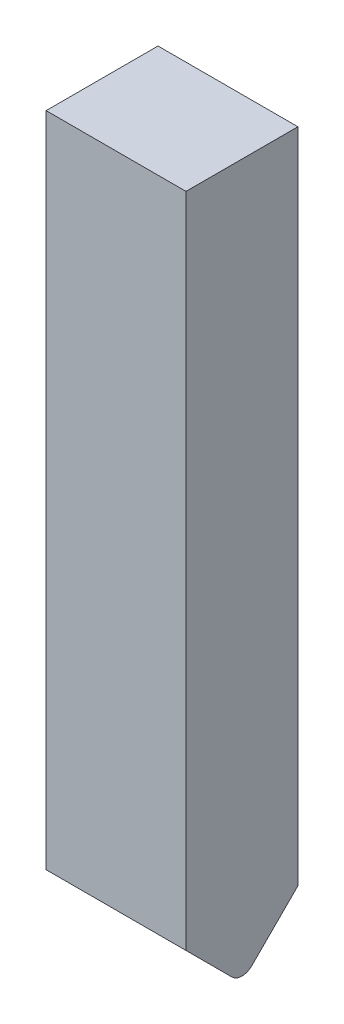
ISO-10303-21;
HEADER;
FILE_DESCRIPTION(('STEP AP214'),'2;1');
FILE_NAME('part.step','',(''),(''),'','','');
FILE_SCHEMA(('AUTOMOTIVE_DESIGN { 1 0 10303 214 1 1 1 1 }'));
ENDSEC;
DATA;
#1=APPLICATION_CONTEXT('core data for automotive mechanical design processes');
#2=APPLICATION_PROTOCOL_DEFINITION('international standard','automotive_design',2000,#1);
#3=PRODUCT_CONTEXT('',#1,'mechanical');
#4=PRODUCT('Part','Part','',(#3));
#5=PRODUCT_RELATED_PRODUCT_CATEGORY('part','',(#4));
#6=PRODUCT_DEFINITION_FORMATION('','',#4);
#7=PRODUCT_DEFINITION_CONTEXT('part definition',#1,'design');
#8=PRODUCT_DEFINITION('design','',#6,#7);
#9=PRODUCT_DEFINITION_SHAPE('','',#8);
#10=(LENGTH_UNIT() NAMED_UNIT(*) SI_UNIT(.MILLI.,.METRE.));
#11=(NAMED_UNIT(*) PLANE_ANGLE_UNIT() SI_UNIT($,.RADIAN.));
#12=(NAMED_UNIT(*) SI_UNIT($,.STERADIAN.) SOLID_ANGLE_UNIT());
#13=UNCERTAINTY_MEASURE_WITH_UNIT(LENGTH_MEASURE(1.E-05),#10,'distance_accuracy_value','');
#14=(GEOMETRIC_REPRESENTATION_CONTEXT(3) GLOBAL_UNCERTAINTY_ASSIGNED_CONTEXT((#13)) GLOBAL_UNIT_ASSIGNED_CONTEXT((#10,
#11,#12)) REPRESENTATION_CONTEXT('',''));
#15=CARTESIAN_POINT('',(0.,0.,0.));
#16=DIRECTION('',(0.,0.,1.));
#17=DIRECTION('',(1.,0.,0.));
#18=AXIS2_PLACEMENT_3D('',#15,#16,#17);
#19=CARTESIAN_POINT('',(25.4,0.,10.16));
#20=DIRECTION('',(0.,-1.,0.));
#21=DIRECTION('',(0.,0.,-1.));
#22=AXIS2_PLACEMENT_3D('',#19,#20,#21);
#23=PLANE('',#22);
#24=DIRECTION('',(0.,0.,1.));
#25=VECTOR('',#24,1.);
#26=CARTESIAN_POINT('',(0.,0.,10.16));
#27=LINE('',#26,#25);
#28=CARTESIAN_POINT('',(0.,0.,-10.16));
#29=VERTEX_POINT('',#28);
#30=CARTESIAN_POINT('',(0.,0.,10.16));
#31=VERTEX_POINT('',#30);
#32=EDGE_CURVE('E117',#29,#31,#27,.T.);
#33=ORIENTED_EDGE('',*,*,#32,.T.);
#34=DIRECTION('',(-1.,0.,0.));
#35=VECTOR('',#34,1.);
#36=CARTESIAN_POINT('',(25.4,0.,10.16));
#37=LINE('',#36,#35);
#38=CARTESIAN_POINT('',(25.4,0.,10.16));
#39=VERTEX_POINT('',#38);
#40=EDGE_CURVE('E97',#39,#31,#37,.T.);
#41=ORIENTED_EDGE('',*,*,#40,.F.);
#42=DIRECTION('',(0.,0.,1.));
#43=VECTOR('',#42,1.);
#44=CARTESIAN_POINT('',(25.4,0.,10.16));
#45=LINE('',#44,#43);
#46=CARTESIAN_POINT('',(25.4,0.,-10.16));
#47=VERTEX_POINT('',#46);
#48=EDGE_CURVE('E104',#47,#39,#45,.T.);
#49=ORIENTED_EDGE('',*,*,#48,.F.);
#50=DIRECTION('',(-1.,0.,0.));
#51=VECTOR('',#50,1.);
#52=CARTESIAN_POINT('',(25.4,0.,-10.16));
#53=LINE('',#52,#51);
#54=EDGE_CURVE('E134',#47,#29,#53,.T.);
#55=ORIENTED_EDGE('',*,*,#54,.T.);
#56=EDGE_LOOP('',(#33,#41,#49,#55));
#57=FACE_BOUND('',#56,.T.);
#58=ADVANCED_FACE('F39',(#57),#23,.F.);
#59=CARTESIAN_POINT('',(25.4,0.,10.16));
#60=DIRECTION('',(0.,0.,-1.));
#61=DIRECTION('',(0.,1.,0.));
#62=AXIS2_PLACEMENT_3D('',#59,#60,#61);
#63=PLANE('',#62);
#64=DIRECTION('',(0.,-1.,0.));
#65=VECTOR('',#64,1.);
#66=CARTESIAN_POINT('',(0.,0.,10.16));
#67=LINE('',#66,#65);
#68=CARTESIAN_POINT('',(0.,-119.38,10.16));
#69=VERTEX_POINT('',#68);
#70=EDGE_CURVE('E145',#31,#69,#67,.T.);
#71=ORIENTED_EDGE('',*,*,#70,.T.);
#72=DIRECTION('',(-1.,0.,0.));
#73=VECTOR('',#72,1.);
#74=CARTESIAN_POINT('',(25.4,-119.38,10.16));
#75=LINE('',#74,#73);
#76=CARTESIAN_POINT('',(25.4,-119.38,10.16));
#77=VERTEX_POINT('',#76);
#78=EDGE_CURVE('E100',#77,#69,#75,.T.);
#79=ORIENTED_EDGE('',*,*,#78,.F.);
#80=DIRECTION('',(0.,-1.,0.));
#81=VECTOR('',#80,1.);
#82=CARTESIAN_POINT('',(25.4,0.,10.16));
#83=LINE('',#82,#81);
#84=EDGE_CURVE('E93',#39,#77,#83,.T.);
#85=ORIENTED_EDGE('',*,*,#84,.F.);
#86=ORIENTED_EDGE('',*,*,#40,.T.);
#87=EDGE_LOOP('',(#71,#79,#85,#86));
#88=FACE_BOUND('',#87,.T.);
#89=ADVANCED_FACE('F95',(#88),#63,.F.);
#90=CARTESIAN_POINT('',(25.4,-119.38,10.16));
#91=DIRECTION('',(0.,0.707106781186546,-0.707106781186549));
#92=DIRECTION('',(0.,0.707106781186549,0.707106781186546));
#93=AXIS2_PLACEMENT_3D('',#90,#91,#92);
#94=PLANE('',#93);
#95=DIRECTION('',(0.,-0.707106781186549,-0.707106781186547));
#96=VECTOR('',#95,1.);
#97=CARTESIAN_POINT('',(0.,-119.38,10.16));
#98=LINE('',#97,#96);
#99=CARTESIAN_POINT('',(0.,-127.743948775786,1.79605122421383));
#100=VERTEX_POINT('',#99);
#101=EDGE_CURVE('E142',#69,#100,#98,.T.);
#102=ORIENTED_EDGE('',*,*,#101,.T.);
#103=DIRECTION('',(-1.,0.,0.));
#104=VECTOR('',#103,1.);
#105=CARTESIAN_POINT('',(25.4,-127.743948775786,1.79605122421383));
#106=LINE('',#105,#104);
#107=CARTESIAN_POINT('',(25.4,-127.743948775786,1.79605122421383));
#108=VERTEX_POINT('',#107);
#109=EDGE_CURVE('E48',#100,#108,#106,.F.);
#110=ORIENTED_EDGE('',*,*,#109,.T.);
#111=DIRECTION('',(0.,-0.707106781186549,-0.707106781186547));
#112=VECTOR('',#111,1.);
#113=CARTESIAN_POINT('',(25.4,-119.38,10.16));
#114=LINE('',#113,#112);
#115=EDGE_CURVE('E103',#77,#108,#114,.T.);
#116=ORIENTED_EDGE('',*,*,#115,.F.);
#117=ORIENTED_EDGE('',*,*,#78,.T.);
#118=EDGE_LOOP('',(#102,#110,#116,#117));
#119=FACE_BOUND('',#118,.T.);
#120=ADVANCED_FACE('F174',(#119),#94,.F.);
#121=CARTESIAN_POINT('',(25.4,-129.54,0.));
#122=DIRECTION('',(0.,0.707106781186548,0.707106781186547));
#123=DIRECTION('',(0.,-0.707106781186547,0.707106781186548));
#124=AXIS2_PLACEMENT_3D('',#121,#122,#123);
#125=PLANE('',#124);
#126=DIRECTION('',(0.,0.707106781186547,-0.707106781186548));
#127=VECTOR('',#126,1.);
#128=CARTESIAN_POINT('',(25.4,-129.54,0.));
#129=LINE('',#128,#127);
#130=CARTESIAN_POINT('',(25.4,-127.743948775786,-1.79605122421384));
#131=VERTEX_POINT('',#130);
#132=CARTESIAN_POINT('',(25.4,-119.38,-10.16));
#133=VERTEX_POINT('',#132);
#134=EDGE_CURVE('E152',#131,#133,#129,.T.);
#135=ORIENTED_EDGE('',*,*,#134,.F.);
#136=DIRECTION('',(-1.,0.,0.));
#137=VECTOR('',#136,1.);
#138=CARTESIAN_POINT('',(25.4,-127.743948775786,-1.79605122421384));
#139=LINE('',#138,#137);
#140=CARTESIAN_POINT('',(0.,-127.743948775786,-1.79605122421384));
#141=VERTEX_POINT('',#140);
#142=EDGE_CURVE('E119',#131,#141,#139,.T.);
#143=ORIENTED_EDGE('',*,*,#142,.T.);
#144=DIRECTION('',(0.,0.707106781186547,-0.707106781186548));
#145=VECTOR('',#144,1.);
#146=CARTESIAN_POINT('',(0.,-129.54,0.));
#147=LINE('',#146,#145);
#148=CARTESIAN_POINT('',(0.,-119.38,-10.16));
#149=VERTEX_POINT('',#148);
#150=EDGE_CURVE('E139',#141,#149,#147,.T.);
#151=ORIENTED_EDGE('',*,*,#150,.T.);
#152=DIRECTION('',(-1.,0.,0.));
#153=VECTOR('',#152,1.);
#154=CARTESIAN_POINT('',(25.4,-119.38,-10.16));
#155=LINE('',#154,#153);
#156=EDGE_CURVE('E125',#133,#149,#155,.T.);
#157=ORIENTED_EDGE('',*,*,#156,.F.);
#158=EDGE_LOOP('',(#135,#143,#151,#157));
#159=FACE_BOUND('',#158,.T.);
#160=ADVANCED_FACE('F161',(#159),#125,.F.);
#161=CARTESIAN_POINT('',(25.4,0.,-10.16));
#162=DIRECTION('',(0.,0.,1.));
#163=DIRECTION('',(0.,-1.,0.));
#164=AXIS2_PLACEMENT_3D('',#161,#162,#163);
#165=PLANE('',#164);
#166=DIRECTION('',(0.,1.,0.));
#167=VECTOR('',#166,1.);
#168=CARTESIAN_POINT('',(0.,0.,-10.16));
#169=LINE('',#168,#167);
#170=EDGE_CURVE('E114',#149,#29,#169,.T.);
#171=ORIENTED_EDGE('',*,*,#170,.T.);
#172=ORIENTED_EDGE('',*,*,#54,.F.);
#173=DIRECTION('',(0.,1.,0.));
#174=VECTOR('',#173,1.);
#175=CARTESIAN_POINT('',(25.4,0.,-10.16));
#176=LINE('',#175,#174);
#177=EDGE_CURVE('E109',#133,#47,#176,.T.);
#178=ORIENTED_EDGE('',*,*,#177,.F.);
#179=ORIENTED_EDGE('',*,*,#156,.T.);
#180=EDGE_LOOP('',(#171,#172,#178,#179));
#181=FACE_BOUND('',#180,.T.);
#182=ADVANCED_FACE('F166',(#181),#165,.F.);
#183=CARTESIAN_POINT('',(25.4,0.,0.));
#184=DIRECTION('',(-1.,0.,0.));
#185=DIRECTION('',(0.,0.,1.));
#186=AXIS2_PLACEMENT_3D('',#183,#184,#185);
#187=PLANE('',#186);
#188=ORIENTED_EDGE('',*,*,#115,.T.);
#189=CARTESIAN_POINT('',(25.4,-125.947897551572,0.));
#190=DIRECTION('',(-1.,0.,0.));
#191=DIRECTION('',(0.,0.,1.));
#192=AXIS2_PLACEMENT_3D('',#189,#190,#191);
#193=CIRCLE('',#192,2.54);
#194=EDGE_CURVE('E11',#108,#131,#193,.F.);
#195=ORIENTED_EDGE('',*,*,#194,.T.);
#196=ORIENTED_EDGE('',*,*,#134,.T.);
#197=ORIENTED_EDGE('',*,*,#177,.T.);
#198=ORIENTED_EDGE('',*,*,#48,.T.);
#199=ORIENTED_EDGE('',*,*,#84,.T.);
#200=EDGE_LOOP('',(#188,#195,#196,#197,#198,#199));
#201=FACE_BOUND('',#200,.T.);
#202=ADVANCED_FACE('F107',(#201),#187,.F.);
#203=CARTESIAN_POINT('',(0.,0.,0.));
#204=DIRECTION('',(-1.,0.,0.));
#205=DIRECTION('',(0.,0.,1.));
#206=AXIS2_PLACEMENT_3D('',#203,#204,#205);
#207=PLANE('',#206);
#208=ORIENTED_EDGE('',*,*,#150,.F.);
#209=CARTESIAN_POINT('',(0.,-125.947897551572,0.));
#210=DIRECTION('',(-1.,0.,0.));
#211=DIRECTION('',(0.,0.,1.));
#212=AXIS2_PLACEMENT_3D('',#209,#210,#211);
#213=CIRCLE('',#212,2.54);
#214=EDGE_CURVE('E62',#141,#100,#213,.T.);
#215=ORIENTED_EDGE('',*,*,#214,.T.);
#216=ORIENTED_EDGE('',*,*,#101,.F.);
#217=ORIENTED_EDGE('',*,*,#70,.F.);
#218=ORIENTED_EDGE('',*,*,#32,.F.);
#219=ORIENTED_EDGE('',*,*,#170,.F.);
#220=EDGE_LOOP('',(#208,#215,#216,#217,#218,#219));
#221=FACE_BOUND('',#220,.T.);
#222=ADVANCED_FACE('F164',(#221),#207,.T.);
#223=CARTESIAN_POINT('',(25.4,-125.947897551572,0.));
#224=DIRECTION('',(-1.,0.,0.));
#225=DIRECTION('',(0.,0.,1.));
#226=AXIS2_PLACEMENT_3D('',#223,#224,#225);
#227=CYLINDRICAL_SURFACE('',#226,2.54);
#228=ORIENTED_EDGE('',*,*,#194,.F.);
#229=ORIENTED_EDGE('',*,*,#109,.F.);
#230=ORIENTED_EDGE('',*,*,#214,.F.);
#231=ORIENTED_EDGE('',*,*,#142,.F.);
#232=EDGE_LOOP('',(#228,#229,#230,#231));
#233=FACE_BOUND('',#232,.T.);
#234=ADVANCED_FACE('F41',(#233),#227,.T.);
#235=CLOSED_SHELL('',(#58,#89,#120,#160,#182,#202,#222,#234));
#236=MANIFOLD_SOLID_BREP('B2',#235);
#237=ADVANCED_BREP_SHAPE_REPRESENTATION('',(#18,#236),#14);
#238=SHAPE_DEFINITION_REPRESENTATION(#9,#237);
ENDSEC;
END-ISO-10303-21;
